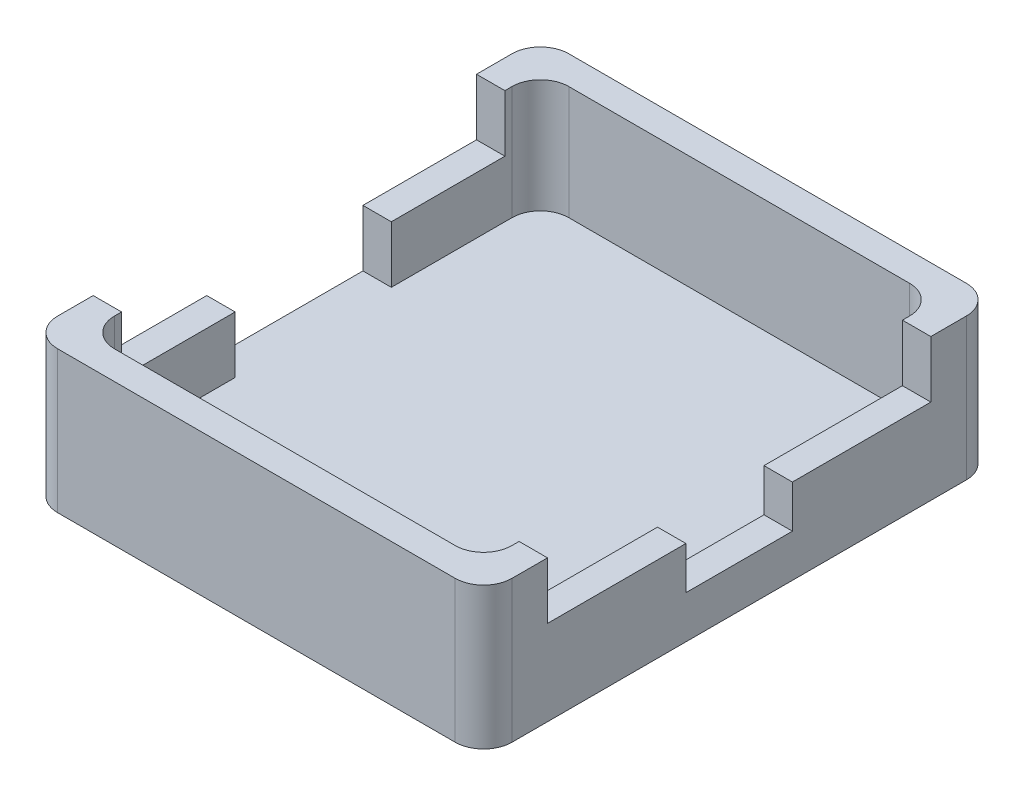
ISO-10303-21;
HEADER;
FILE_DESCRIPTION(('STEP AP214'),'2;1');
FILE_NAME('part.step','',(''),(''),'','','');
FILE_SCHEMA(('AUTOMOTIVE_DESIGN { 1 0 10303 214 1 1 1 1 }'));
ENDSEC;
DATA;
#1=APPLICATION_CONTEXT('core data for automotive mechanical design processes');
#2=APPLICATION_PROTOCOL_DEFINITION('international standard','automotive_design',2000,#1);
#3=PRODUCT_CONTEXT('',#1,'mechanical');
#4=PRODUCT('Part','Part','',(#3));
#5=PRODUCT_RELATED_PRODUCT_CATEGORY('part','',(#4));
#6=PRODUCT_DEFINITION_FORMATION('','',#4);
#7=PRODUCT_DEFINITION_CONTEXT('part definition',#1,'design');
#8=PRODUCT_DEFINITION('design','',#6,#7);
#9=PRODUCT_DEFINITION_SHAPE('','',#8);
#10=(LENGTH_UNIT() NAMED_UNIT(*) SI_UNIT(.MILLI.,.METRE.));
#11=(NAMED_UNIT(*) PLANE_ANGLE_UNIT() SI_UNIT($,.RADIAN.));
#12=(NAMED_UNIT(*) SI_UNIT($,.STERADIAN.) SOLID_ANGLE_UNIT());
#13=UNCERTAINTY_MEASURE_WITH_UNIT(LENGTH_MEASURE(1.E-05),#10,'distance_accuracy_value','');
#14=(GEOMETRIC_REPRESENTATION_CONTEXT(3) GLOBAL_UNCERTAINTY_ASSIGNED_CONTEXT((#13)) GLOBAL_UNIT_ASSIGNED_CONTEXT((#10,
#11,#12)) REPRESENTATION_CONTEXT('',''));
#15=CARTESIAN_POINT('',(0.,0.,0.));
#16=DIRECTION('',(0.,0.,1.));
#17=DIRECTION('',(1.,0.,0.));
#18=AXIS2_PLACEMENT_3D('',#15,#16,#17);
#19=CARTESIAN_POINT('',(0.,10.,0.));
#20=DIRECTION('',(0.,1.,0.));
#21=DIRECTION('',(0.,0.,1.));
#22=AXIS2_PLACEMENT_3D('',#19,#20,#21);
#23=PLANE('',#22);
#24=DIRECTION('',(0.,0.,1.));
#25=VECTOR('',#24,1.);
#26=CARTESIAN_POINT('',(-16.,10.,0.));
#27=LINE('',#26,#25);
#28=CARTESIAN_POINT('',(-16.,10.,13.5));
#29=VERTEX_POINT('',#28);
#30=CARTESIAN_POINT('',(-16.,10.,16.));
#31=VERTEX_POINT('',#30);
#32=EDGE_CURVE('E435',#29,#31,#27,.T.);
#33=ORIENTED_EDGE('',*,*,#32,.T.);
#34=CARTESIAN_POINT('',(-14.,10.,16.));
#35=DIRECTION('',(0.,1.,0.));
#36=DIRECTION('',(0.,0.,1.));
#37=AXIS2_PLACEMENT_3D('',#34,#35,#36);
#38=CIRCLE('',#37,2.);
#39=CARTESIAN_POINT('',(-14.,10.,18.));
#40=VERTEX_POINT('',#39);
#41=EDGE_CURVE('E537',#31,#40,#38,.T.);
#42=ORIENTED_EDGE('',*,*,#41,.T.);
#43=DIRECTION('',(1.,0.,0.));
#44=VECTOR('',#43,1.);
#45=CARTESIAN_POINT('',(0.,10.,18.));
#46=LINE('',#45,#44);
#47=CARTESIAN_POINT('',(14.,10.,18.));
#48=VERTEX_POINT('',#47);
#49=EDGE_CURVE('E424',#40,#48,#46,.T.);
#50=ORIENTED_EDGE('',*,*,#49,.T.);
#51=CARTESIAN_POINT('',(14.,10.,16.));
#52=DIRECTION('',(0.,1.,0.));
#53=DIRECTION('',(0.,0.,1.));
#54=AXIS2_PLACEMENT_3D('',#51,#52,#53);
#55=CIRCLE('',#54,2.);
#56=CARTESIAN_POINT('',(16.,10.,16.));
#57=VERTEX_POINT('',#56);
#58=EDGE_CURVE('E534',#48,#57,#55,.T.);
#59=ORIENTED_EDGE('',*,*,#58,.T.);
#60=DIRECTION('',(0.,0.,-1.));
#61=VECTOR('',#60,1.);
#62=CARTESIAN_POINT('',(16.,10.,0.));
#63=LINE('',#62,#61);
#64=CARTESIAN_POINT('',(16.,9.99999999999999,13.5));
#65=VERTEX_POINT('',#64);
#66=EDGE_CURVE('E429',#57,#65,#63,.T.);
#67=ORIENTED_EDGE('',*,*,#66,.T.);
#68=DIRECTION('',(1.,0.,0.));
#69=VECTOR('',#68,1.);
#70=CARTESIAN_POINT('',(-13.8926513619627,9.99999999999999,13.5));
#71=LINE('',#70,#69);
#72=CARTESIAN_POINT('',(14.,9.99999999999999,13.5));
#73=VERTEX_POINT('',#72);
#74=EDGE_CURVE('E323',#73,#65,#71,.T.);
#75=ORIENTED_EDGE('',*,*,#74,.F.);
#76=DIRECTION('',(0.,0.,-1.));
#77=VECTOR('',#76,1.);
#78=CARTESIAN_POINT('',(14.,10.,0.));
#79=LINE('',#78,#77);
#80=CARTESIAN_POINT('',(14.,10.,14.));
#81=VERTEX_POINT('',#80);
#82=EDGE_CURVE('E286',#81,#73,#79,.T.);
#83=ORIENTED_EDGE('',*,*,#82,.F.);
#84=CARTESIAN_POINT('',(12.,10.,14.));
#85=DIRECTION('',(0.,1.,0.));
#86=DIRECTION('',(0.,0.,1.));
#87=AXIS2_PLACEMENT_3D('',#84,#85,#86);
#88=CIRCLE('',#87,2.);
#89=CARTESIAN_POINT('',(12.,10.,16.));
#90=VERTEX_POINT('',#89);
#91=EDGE_CURVE('E11',#81,#90,#88,.F.);
#92=ORIENTED_EDGE('',*,*,#91,.T.);
#93=DIRECTION('',(1.,0.,0.));
#94=VECTOR('',#93,1.);
#95=CARTESIAN_POINT('',(0.,10.,16.));
#96=LINE('',#95,#94);
#97=CARTESIAN_POINT('',(-12.,10.,16.));
#98=VERTEX_POINT('',#97);
#99=EDGE_CURVE('E411',#98,#90,#96,.T.);
#100=ORIENTED_EDGE('',*,*,#99,.F.);
#101=CARTESIAN_POINT('',(-12.,10.,14.));
#102=DIRECTION('',(0.,1.,0.));
#103=DIRECTION('',(0.,0.,1.));
#104=AXIS2_PLACEMENT_3D('',#101,#102,#103);
#105=CIRCLE('',#104,2.);
#106=CARTESIAN_POINT('',(-14.,10.,14.));
#107=VERTEX_POINT('',#106);
#108=EDGE_CURVE('E558',#98,#107,#105,.F.);
#109=ORIENTED_EDGE('',*,*,#108,.T.);
#110=DIRECTION('',(0.,0.,-1.));
#111=VECTOR('',#110,1.);
#112=CARTESIAN_POINT('',(-14.,10.,0.));
#113=LINE('',#112,#111);
#114=CARTESIAN_POINT('',(-14.,10.,13.5));
#115=VERTEX_POINT('',#114);
#116=EDGE_CURVE('E417',#107,#115,#113,.T.);
#117=ORIENTED_EDGE('',*,*,#116,.T.);
#118=DIRECTION('',(-1.,0.,0.));
#119=VECTOR('',#118,1.);
#120=CARTESIAN_POINT('',(14.1602556806574,10.,13.5));
#121=LINE('',#120,#119);
#122=EDGE_CURVE('E341',#115,#29,#121,.T.);
#123=ORIENTED_EDGE('',*,*,#122,.T.);
#124=EDGE_LOOP('',(#33,#42,#50,#59,#67,#75,#83,#92,#100,#109,#117,#123));
#125=FACE_BOUND('',#124,.T.);
#126=ADVANCED_FACE('F47',(#125),#23,.T.);
#127=CARTESIAN_POINT('',(-14.,10.,0.));
#128=DIRECTION('',(-1.,0.,0.));
#129=DIRECTION('',(0.,0.,1.));
#130=AXIS2_PLACEMENT_3D('',#127,#128,#129);
#131=PLANE('',#130);
#132=ORIENTED_EDGE('',*,*,#116,.F.);
#133=DIRECTION('',(0.,-1.,0.));
#134=VECTOR('',#133,1.);
#135=CARTESIAN_POINT('',(-14.,10.,14.));
#136=LINE('',#135,#134);
#137=CARTESIAN_POINT('',(-14.,2.,14.));
#138=VERTEX_POINT('',#137);
#139=EDGE_CURVE('E468',#107,#138,#136,.T.);
#140=ORIENTED_EDGE('',*,*,#139,.T.);
#141=DIRECTION('',(0.,0.,-1.));
#142=VECTOR('',#141,1.);
#143=CARTESIAN_POINT('',(-14.,2.,0.));
#144=LINE('',#143,#142);
#145=CARTESIAN_POINT('',(-14.,2.,5.49999999999999));
#146=VERTEX_POINT('',#145);
#147=EDGE_CURVE('E448',#138,#146,#144,.T.);
#148=ORIENTED_EDGE('',*,*,#147,.T.);
#149=DIRECTION('',(0.,-1.,0.));
#150=VECTOR('',#149,1.);
#151=CARTESIAN_POINT('',(-14.,6.,5.49999999999999));
#152=LINE('',#151,#150);
#153=CARTESIAN_POINT('',(-14.,6.,5.49999999999999));
#154=VERTEX_POINT('',#153);
#155=EDGE_CURVE('E344',#154,#146,#152,.T.);
#156=ORIENTED_EDGE('',*,*,#155,.F.);
#157=DIRECTION('',(0.,0.,-1.));
#158=VECTOR('',#157,1.);
#159=CARTESIAN_POINT('',(-14.,6.,13.5));
#160=LINE('',#159,#158);
#161=CARTESIAN_POINT('',(-14.,6.,13.5));
#162=VERTEX_POINT('',#161);
#163=EDGE_CURVE('E348',#162,#154,#160,.T.);
#164=ORIENTED_EDGE('',*,*,#163,.F.);
#165=DIRECTION('',(0.,-1.,0.));
#166=VECTOR('',#165,1.);
#167=CARTESIAN_POINT('',(-14.,10.,13.5));
#168=LINE('',#167,#166);
#169=EDGE_CURVE('E351',#115,#162,#168,.T.);
#170=ORIENTED_EDGE('',*,*,#169,.F.);
#171=EDGE_LOOP('',(#132,#140,#148,#156,#164,#170));
#172=FACE_BOUND('',#171,.T.);
#173=ADVANCED_FACE('F640',(#172),#131,.F.);
#174=CARTESIAN_POINT('',(16.,2.,18.));
#175=DIRECTION('',(-1.,0.,0.));
#176=DIRECTION('',(0.,0.,1.));
#177=AXIS2_PLACEMENT_3D('',#174,#175,#176);
#178=PLANE('',#177);
#179=DIRECTION('',(0.,0.,-1.));
#180=VECTOR('',#179,1.);
#181=CARTESIAN_POINT('',(16.,0.,18.));
#182=LINE('',#181,#180);
#183=CARTESIAN_POINT('',(16.,0.,16.));
#184=VERTEX_POINT('',#183);
#185=CARTESIAN_POINT('',(16.,0.,-16.));
#186=VERTEX_POINT('',#185);
#187=EDGE_CURVE('E439',#184,#186,#182,.T.);
#188=ORIENTED_EDGE('',*,*,#187,.T.);
#189=DIRECTION('',(0.,-1.,0.));
#190=VECTOR('',#189,1.);
#191=CARTESIAN_POINT('',(16.,2.,-16.));
#192=LINE('',#191,#190);
#193=CARTESIAN_POINT('',(16.,10.,-16.));
#194=VERTEX_POINT('',#193);
#195=EDGE_CURVE('E63',#186,#194,#192,.F.);
#196=ORIENTED_EDGE('',*,*,#195,.T.);
#197=CARTESIAN_POINT('',(16.,10.,-13.5));
#198=VERTEX_POINT('',#197);
#199=EDGE_CURVE('E428',#198,#194,#63,.T.);
#200=ORIENTED_EDGE('',*,*,#199,.F.);
#201=DIRECTION('',(0.,1.,0.));
#202=VECTOR('',#201,1.);
#203=CARTESIAN_POINT('',(16.,9.99999999999999,-13.5));
#204=LINE('',#203,#202);
#205=CARTESIAN_POINT('',(16.,6.,-13.5));
#206=VERTEX_POINT('',#205);
#207=EDGE_CURVE('E288',#206,#198,#204,.T.);
#208=ORIENTED_EDGE('',*,*,#207,.F.);
#209=DIRECTION('',(0.,0.,-1.));
#210=VECTOR('',#209,1.);
#211=CARTESIAN_POINT('',(16.,6.,-13.5));
#212=LINE('',#211,#210);
#213=CARTESIAN_POINT('',(16.,6.,-3.75));
#214=VERTEX_POINT('',#213);
#215=EDGE_CURVE('E291',#214,#206,#212,.T.);
#216=ORIENTED_EDGE('',*,*,#215,.F.);
#217=DIRECTION('',(0.,1.,0.));
#218=VECTOR('',#217,1.);
#219=CARTESIAN_POINT('',(16.,6.,-3.75));
#220=LINE('',#219,#218);
#221=CARTESIAN_POINT('',(16.,3.,-3.75));
#222=VERTEX_POINT('',#221);
#223=EDGE_CURVE('E692',#222,#214,#220,.T.);
#224=ORIENTED_EDGE('',*,*,#223,.F.);
#225=DIRECTION('',(0.,0.,-1.));
#226=VECTOR('',#225,1.);
#227=CARTESIAN_POINT('',(16.,3.,3.75));
#228=LINE('',#227,#226);
#229=CARTESIAN_POINT('',(16.,3.,3.75));
#230=VERTEX_POINT('',#229);
#231=EDGE_CURVE('E695',#230,#222,#228,.T.);
#232=ORIENTED_EDGE('',*,*,#231,.F.);
#233=DIRECTION('',(0.,-1.,0.));
#234=VECTOR('',#233,1.);
#235=CARTESIAN_POINT('',(16.,6.,3.75));
#236=LINE('',#235,#234);
#237=CARTESIAN_POINT('',(16.,6.,3.75));
#238=VERTEX_POINT('',#237);
#239=EDGE_CURVE('E701',#238,#230,#236,.T.);
#240=ORIENTED_EDGE('',*,*,#239,.F.);
#241=DIRECTION('',(0.,0.,-1.));
#242=VECTOR('',#241,1.);
#243=CARTESIAN_POINT('',(16.,6.,13.5));
#244=LINE('',#243,#242);
#245=CARTESIAN_POINT('',(16.,6.,13.5));
#246=VERTEX_POINT('',#245);
#247=EDGE_CURVE('E704',#246,#238,#244,.T.);
#248=ORIENTED_EDGE('',*,*,#247,.F.);
#249=DIRECTION('',(0.,-1.,0.));
#250=VECTOR('',#249,1.);
#251=CARTESIAN_POINT('',(16.,9.99999999999999,13.5));
#252=LINE('',#251,#250);
#253=EDGE_CURVE('E279',#65,#246,#252,.T.);
#254=ORIENTED_EDGE('',*,*,#253,.F.);
#255=ORIENTED_EDGE('',*,*,#66,.F.);
#256=DIRECTION('',(0.,-1.,0.));
#257=VECTOR('',#256,1.);
#258=CARTESIAN_POINT('',(16.,2.,16.));
#259=LINE('',#258,#257);
#260=EDGE_CURVE('E552',#57,#184,#259,.T.);
#261=ORIENTED_EDGE('',*,*,#260,.T.);
#262=EDGE_LOOP('',(#188,#196,#200,#208,#216,#224,#232,#240,#248,#254,#255,#261));
#263=FACE_BOUND('',#262,.T.);
#264=ADVANCED_FACE('F622',(#263),#178,.F.);
#265=CARTESIAN_POINT('',(-16.,2.,-18.));
#266=DIRECTION('',(0.,0.,1.));
#267=DIRECTION('',(1.,0.,0.));
#268=AXIS2_PLACEMENT_3D('',#265,#266,#267);
#269=PLANE('',#268);
#270=DIRECTION('',(-1.,0.,0.));
#271=VECTOR('',#270,1.);
#272=CARTESIAN_POINT('',(-16.,0.,-18.));
#273=LINE('',#272,#271);
#274=CARTESIAN_POINT('',(14.,0.,-18.));
#275=VERTEX_POINT('',#274);
#276=CARTESIAN_POINT('',(-14.,0.,-18.));
#277=VERTEX_POINT('',#276);
#278=EDGE_CURVE('E457',#275,#277,#273,.T.);
#279=ORIENTED_EDGE('',*,*,#278,.T.);
#280=DIRECTION('',(0.,-1.,0.));
#281=VECTOR('',#280,1.);
#282=CARTESIAN_POINT('',(-14.,2.,-18.));
#283=LINE('',#282,#281);
#284=CARTESIAN_POINT('',(-14.,10.,-18.));
#285=VERTEX_POINT('',#284);
#286=EDGE_CURVE('E71',#277,#285,#283,.F.);
#287=ORIENTED_EDGE('',*,*,#286,.T.);
#288=DIRECTION('',(-1.,0.,0.));
#289=VECTOR('',#288,1.);
#290=CARTESIAN_POINT('',(0.,10.,-18.));
#291=LINE('',#290,#289);
#292=CARTESIAN_POINT('',(14.,10.,-18.));
#293=VERTEX_POINT('',#292);
#294=EDGE_CURVE('E432',#293,#285,#291,.T.);
#295=ORIENTED_EDGE('',*,*,#294,.F.);
#296=DIRECTION('',(0.,-1.,0.));
#297=VECTOR('',#296,1.);
#298=CARTESIAN_POINT('',(14.,2.,-18.));
#299=LINE('',#298,#297);
#300=EDGE_CURVE('E540',#293,#275,#299,.T.);
#301=ORIENTED_EDGE('',*,*,#300,.T.);
#302=EDGE_LOOP('',(#279,#287,#295,#301));
#303=FACE_BOUND('',#302,.T.);
#304=ADVANCED_FACE('F675',(#303),#269,.F.);
#305=CARTESIAN_POINT('',(-16.,2.,18.));
#306=DIRECTION('',(1.,0.,0.));
#307=DIRECTION('',(0.,0.,-1.));
#308=AXIS2_PLACEMENT_3D('',#305,#306,#307);
#309=PLANE('',#308);
#310=DIRECTION('',(0.,0.,1.));
#311=VECTOR('',#310,1.);
#312=CARTESIAN_POINT('',(-16.,0.,18.));
#313=LINE('',#312,#311);
#314=CARTESIAN_POINT('',(-16.,0.,-16.));
#315=VERTEX_POINT('',#314);
#316=CARTESIAN_POINT('',(-16.,0.,16.));
#317=VERTEX_POINT('',#316);
#318=EDGE_CURVE('E460',#315,#317,#313,.T.);
#319=ORIENTED_EDGE('',*,*,#318,.T.);
#320=DIRECTION('',(0.,-1.,0.));
#321=VECTOR('',#320,1.);
#322=CARTESIAN_POINT('',(-16.,2.,16.));
#323=LINE('',#322,#321);
#324=EDGE_CURVE('E531',#317,#31,#323,.F.);
#325=ORIENTED_EDGE('',*,*,#324,.T.);
#326=ORIENTED_EDGE('',*,*,#32,.F.);
#327=DIRECTION('',(0.,1.,0.));
#328=VECTOR('',#327,1.);
#329=CARTESIAN_POINT('',(-16.,10.,13.5));
#330=LINE('',#329,#328);
#331=CARTESIAN_POINT('',(-16.,6.,13.5));
#332=VERTEX_POINT('',#331);
#333=EDGE_CURVE('E378',#332,#29,#330,.T.);
#334=ORIENTED_EDGE('',*,*,#333,.F.);
#335=DIRECTION('',(0.,0.,1.));
#336=VECTOR('',#335,1.);
#337=CARTESIAN_POINT('',(-16.,6.,13.5));
#338=LINE('',#337,#336);
#339=CARTESIAN_POINT('',(-16.,6.,5.49999999999999));
#340=VERTEX_POINT('',#339);
#341=EDGE_CURVE('E374',#340,#332,#338,.T.);
#342=ORIENTED_EDGE('',*,*,#341,.F.);
#343=DIRECTION('',(0.,1.,0.));
#344=VECTOR('',#343,1.);
#345=CARTESIAN_POINT('',(-16.,6.,5.49999999999999));
#346=LINE('',#345,#344);
#347=CARTESIAN_POINT('',(-16.,2.,5.49999999999999));
#348=VERTEX_POINT('',#347);
#349=EDGE_CURVE('E370',#348,#340,#346,.T.);
#350=ORIENTED_EDGE('',*,*,#349,.F.);
#351=DIRECTION('',(0.,0.,1.));
#352=VECTOR('',#351,1.);
#353=CARTESIAN_POINT('',(-16.,2.,-5.50000000000001));
#354=LINE('',#353,#352);
#355=CARTESIAN_POINT('',(-16.,2.,-5.50000000000001));
#356=VERTEX_POINT('',#355);
#357=EDGE_CURVE('E366',#356,#348,#354,.T.);
#358=ORIENTED_EDGE('',*,*,#357,.F.);
#359=DIRECTION('',(0.,-1.,0.));
#360=VECTOR('',#359,1.);
#361=CARTESIAN_POINT('',(-16.,6.,-5.50000000000001));
#362=LINE('',#361,#360);
#363=CARTESIAN_POINT('',(-16.,6.,-5.50000000000001));
#364=VERTEX_POINT('',#363);
#365=EDGE_CURVE('E362',#364,#356,#362,.T.);
#366=ORIENTED_EDGE('',*,*,#365,.F.);
#367=DIRECTION('',(0.,0.,1.));
#368=VECTOR('',#367,1.);
#369=CARTESIAN_POINT('',(-16.,6.,-13.5));
#370=LINE('',#369,#368);
#371=CARTESIAN_POINT('',(-16.,6.,-13.5));
#372=VERTEX_POINT('',#371);
#373=EDGE_CURVE('E358',#372,#364,#370,.T.);
#374=ORIENTED_EDGE('',*,*,#373,.F.);
#375=DIRECTION('',(0.,-1.,0.));
#376=VECTOR('',#375,1.);
#377=CARTESIAN_POINT('',(-16.,10.,-13.5));
#378=LINE('',#377,#376);
#379=CARTESIAN_POINT('',(-16.,10.,-13.5));
#380=VERTEX_POINT('',#379);
#381=EDGE_CURVE('E336',#380,#372,#378,.T.);
#382=ORIENTED_EDGE('',*,*,#381,.F.);
#383=CARTESIAN_POINT('',(-16.,10.,-16.));
#384=VERTEX_POINT('',#383);
#385=EDGE_CURVE('E436',#384,#380,#27,.T.);
#386=ORIENTED_EDGE('',*,*,#385,.F.);
#387=DIRECTION('',(0.,-1.,0.));
#388=VECTOR('',#387,1.);
#389=CARTESIAN_POINT('',(-16.,2.,-16.));
#390=LINE('',#389,#388);
#391=EDGE_CURVE('E527',#384,#315,#390,.T.);
#392=ORIENTED_EDGE('',*,*,#391,.T.);
#393=EDGE_LOOP('',(#319,#325,#326,#334,#342,#350,#358,#366,#374,#382,#386,#392));
#394=FACE_BOUND('',#393,.T.);
#395=ADVANCED_FACE('F648',(#394),#309,.F.);
#396=CARTESIAN_POINT('',(-16.,2.,18.));
#397=DIRECTION('',(0.,0.,-1.));
#398=DIRECTION('',(-1.,0.,0.));
#399=AXIS2_PLACEMENT_3D('',#396,#397,#398);
#400=PLANE('',#399);
#401=ORIENTED_EDGE('',*,*,#49,.F.);
#402=DIRECTION('',(0.,-1.,0.));
#403=VECTOR('',#402,1.);
#404=CARTESIAN_POINT('',(-14.,2.,18.));
#405=LINE('',#404,#403);
#406=CARTESIAN_POINT('',(-14.,0.,18.));
#407=VERTEX_POINT('',#406);
#408=EDGE_CURVE('E511',#40,#407,#405,.T.);
#409=ORIENTED_EDGE('',*,*,#408,.T.);
#410=DIRECTION('',(1.,0.,0.));
#411=VECTOR('',#410,1.);
#412=CARTESIAN_POINT('',(-16.,0.,18.));
#413=LINE('',#412,#411);
#414=CARTESIAN_POINT('',(14.,0.,18.));
#415=VERTEX_POINT('',#414);
#416=EDGE_CURVE('E464',#407,#415,#413,.T.);
#417=ORIENTED_EDGE('',*,*,#416,.T.);
#418=DIRECTION('',(0.,-1.,0.));
#419=VECTOR('',#418,1.);
#420=CARTESIAN_POINT('',(14.,2.,18.));
#421=LINE('',#420,#419);
#422=EDGE_CURVE('E508',#415,#48,#421,.F.);
#423=ORIENTED_EDGE('',*,*,#422,.T.);
#424=EDGE_LOOP('',(#401,#409,#417,#423));
#425=FACE_BOUND('',#424,.T.);
#426=ADVANCED_FACE('F612',(#425),#400,.F.);
#427=CARTESIAN_POINT('',(0.,0.,0.));
#428=DIRECTION('',(0.,-1.,0.));
#429=DIRECTION('',(0.,0.,-1.));
#430=AXIS2_PLACEMENT_3D('',#427,#428,#429);
#431=PLANE('',#430);
#432=ORIENTED_EDGE('',*,*,#416,.F.);
#433=CARTESIAN_POINT('',(-14.,0.,16.));
#434=DIRECTION('',(0.,-1.,0.));
#435=DIRECTION('',(0.,0.,-1.));
#436=AXIS2_PLACEMENT_3D('',#433,#434,#435);
#437=CIRCLE('',#436,2.);
#438=EDGE_CURVE('E524',#407,#317,#437,.T.);
#439=ORIENTED_EDGE('',*,*,#438,.T.);
#440=ORIENTED_EDGE('',*,*,#318,.F.);
#441=CARTESIAN_POINT('',(-14.,0.,-16.));
#442=DIRECTION('',(0.,-1.,0.));
#443=DIRECTION('',(0.,0.,-1.));
#444=AXIS2_PLACEMENT_3D('',#441,#442,#443);
#445=CIRCLE('',#444,2.);
#446=EDGE_CURVE('E521',#315,#277,#445,.T.);
#447=ORIENTED_EDGE('',*,*,#446,.T.);
#448=ORIENTED_EDGE('',*,*,#278,.F.);
#449=CARTESIAN_POINT('',(14.,0.,-16.));
#450=DIRECTION('',(0.,-1.,0.));
#451=DIRECTION('',(0.,0.,-1.));
#452=AXIS2_PLACEMENT_3D('',#449,#450,#451);
#453=CIRCLE('',#452,2.);
#454=EDGE_CURVE('E518',#275,#186,#453,.T.);
#455=ORIENTED_EDGE('',*,*,#454,.T.);
#456=ORIENTED_EDGE('',*,*,#187,.F.);
#457=CARTESIAN_POINT('',(14.,0.,16.));
#458=DIRECTION('',(0.,-1.,0.));
#459=DIRECTION('',(0.,0.,-1.));
#460=AXIS2_PLACEMENT_3D('',#457,#458,#459);
#461=CIRCLE('',#460,2.);
#462=EDGE_CURVE('E515',#184,#415,#461,.T.);
#463=ORIENTED_EDGE('',*,*,#462,.T.);
#464=EDGE_LOOP('',(#432,#439,#440,#447,#448,#455,#456,#463));
#465=FACE_BOUND('',#464,.T.);
#466=ADVANCED_FACE('F615',(#465),#431,.T.);
#467=CARTESIAN_POINT('',(14.,10.,0.));
#468=DIRECTION('',(-1.,0.,0.));
#469=DIRECTION('',(0.,0.,1.));
#470=AXIS2_PLACEMENT_3D('',#467,#468,#469);
#471=PLANE('',#470);
#472=CARTESIAN_POINT('',(14.,9.99999999999999,-13.5));
#473=VERTEX_POINT('',#472);
#474=CARTESIAN_POINT('',(14.,10.,-14.));
#475=VERTEX_POINT('',#474);
#476=EDGE_CURVE('E412',#473,#475,#79,.T.);
#477=ORIENTED_EDGE('',*,*,#476,.T.);
#478=DIRECTION('',(0.,-1.,0.));
#479=VECTOR('',#478,1.);
#480=CARTESIAN_POINT('',(14.,10.,-14.));
#481=LINE('',#480,#479);
#482=CARTESIAN_POINT('',(14.,2.,-14.));
#483=VERTEX_POINT('',#482);
#484=EDGE_CURVE('E504',#475,#483,#481,.T.);
#485=ORIENTED_EDGE('',*,*,#484,.T.);
#486=DIRECTION('',(0.,0.,-1.));
#487=VECTOR('',#486,1.);
#488=CARTESIAN_POINT('',(14.,2.,0.));
#489=LINE('',#488,#487);
#490=CARTESIAN_POINT('',(14.,2.,14.));
#491=VERTEX_POINT('',#490);
#492=EDGE_CURVE('E408',#491,#483,#489,.T.);
#493=ORIENTED_EDGE('',*,*,#492,.F.);
#494=DIRECTION('',(0.,-1.,0.));
#495=VECTOR('',#494,1.);
#496=CARTESIAN_POINT('',(14.,10.,14.));
#497=LINE('',#496,#495);
#498=EDGE_CURVE('E501',#491,#81,#497,.F.);
#499=ORIENTED_EDGE('',*,*,#498,.T.);
#500=ORIENTED_EDGE('',*,*,#82,.T.);
#501=DIRECTION('',(0.,-1.,0.));
#502=VECTOR('',#501,1.);
#503=CARTESIAN_POINT('',(14.,9.99999999999999,13.5));
#504=LINE('',#503,#502);
#505=CARTESIAN_POINT('',(14.,6.,13.5));
#506=VERTEX_POINT('',#505);
#507=EDGE_CURVE('E276',#73,#506,#504,.T.);
#508=ORIENTED_EDGE('',*,*,#507,.T.);
#509=DIRECTION('',(0.,0.,-1.));
#510=VECTOR('',#509,1.);
#511=CARTESIAN_POINT('',(14.,6.,13.5));
#512=LINE('',#511,#510);
#513=CARTESIAN_POINT('',(14.,6.,3.75));
#514=VERTEX_POINT('',#513);
#515=EDGE_CURVE('E260',#506,#514,#512,.T.);
#516=ORIENTED_EDGE('',*,*,#515,.T.);
#517=DIRECTION('',(0.,-1.,0.));
#518=VECTOR('',#517,1.);
#519=CARTESIAN_POINT('',(14.,6.,3.75));
#520=LINE('',#519,#518);
#521=CARTESIAN_POINT('',(14.,3.,3.75));
#522=VERTEX_POINT('',#521);
#523=EDGE_CURVE('E317',#514,#522,#520,.T.);
#524=ORIENTED_EDGE('',*,*,#523,.T.);
#525=DIRECTION('',(0.,0.,-1.));
#526=VECTOR('',#525,1.);
#527=CARTESIAN_POINT('',(14.,3.,3.75));
#528=LINE('',#527,#526);
#529=CARTESIAN_POINT('',(14.,3.,-3.75));
#530=VERTEX_POINT('',#529);
#531=EDGE_CURVE('E312',#522,#530,#528,.T.);
#532=ORIENTED_EDGE('',*,*,#531,.T.);
#533=DIRECTION('',(0.,1.,0.));
#534=VECTOR('',#533,1.);
#535=CARTESIAN_POINT('',(14.,6.,-3.75));
#536=LINE('',#535,#534);
#537=CARTESIAN_POINT('',(14.,6.,-3.75));
#538=VERTEX_POINT('',#537);
#539=EDGE_CURVE('E307',#530,#538,#536,.T.);
#540=ORIENTED_EDGE('',*,*,#539,.T.);
#541=DIRECTION('',(0.,0.,-1.));
#542=VECTOR('',#541,1.);
#543=CARTESIAN_POINT('',(14.,6.,-13.5));
#544=LINE('',#543,#542);
#545=CARTESIAN_POINT('',(14.,6.,-13.5));
#546=VERTEX_POINT('',#545);
#547=EDGE_CURVE('E302',#538,#546,#544,.T.);
#548=ORIENTED_EDGE('',*,*,#547,.T.);
#549=DIRECTION('',(0.,1.,0.));
#550=VECTOR('',#549,1.);
#551=CARTESIAN_POINT('',(14.,9.99999999999999,-13.5));
#552=LINE('',#551,#550);
#553=EDGE_CURVE('E296',#546,#473,#552,.T.);
#554=ORIENTED_EDGE('',*,*,#553,.T.);
#555=EDGE_LOOP('',(#477,#485,#493,#499,#500,#508,#516,#524,#532,#540,#548,#554));
#556=FACE_BOUND('',#555,.T.);
#557=ADVANCED_FACE('F284',(#556),#471,.T.);
#558=CARTESIAN_POINT('',(0.,10.,16.));
#559=DIRECTION('',(0.,0.,-1.));
#560=DIRECTION('',(-1.,0.,0.));
#561=AXIS2_PLACEMENT_3D('',#558,#559,#560);
#562=PLANE('',#561);
#563=DIRECTION('',(1.,0.,0.));
#564=VECTOR('',#563,1.);
#565=CARTESIAN_POINT('',(0.,2.,16.));
#566=LINE('',#565,#564);
#567=CARTESIAN_POINT('',(-12.,2.,16.));
#568=VERTEX_POINT('',#567);
#569=CARTESIAN_POINT('',(12.,2.,16.));
#570=VERTEX_POINT('',#569);
#571=EDGE_CURVE('E443',#568,#570,#566,.T.);
#572=ORIENTED_EDGE('',*,*,#571,.F.);
#573=DIRECTION('',(0.,-1.,0.));
#574=VECTOR('',#573,1.);
#575=CARTESIAN_POINT('',(-12.,10.,16.));
#576=LINE('',#575,#574);
#577=EDGE_CURVE('E488',#568,#98,#576,.F.);
#578=ORIENTED_EDGE('',*,*,#577,.T.);
#579=ORIENTED_EDGE('',*,*,#99,.T.);
#580=DIRECTION('',(0.,-1.,0.));
#581=VECTOR('',#580,1.);
#582=CARTESIAN_POINT('',(12.,2.,16.));
#583=LINE('',#582,#581);
#584=EDGE_CURVE('E484',#90,#570,#583,.T.);
#585=ORIENTED_EDGE('',*,*,#584,.T.);
#586=EDGE_LOOP('',(#572,#578,#579,#585));
#587=FACE_BOUND('',#586,.T.);
#588=ADVANCED_FACE('F631',(#587),#562,.T.);
#589=CARTESIAN_POINT('',(-14.,2.,-5.50000000000001));
#590=VERTEX_POINT('',#589);
#591=CARTESIAN_POINT('',(-14.,2.,-14.));
#592=VERTEX_POINT('',#591);
#593=EDGE_CURVE('E447',#590,#592,#144,.T.);
#594=ORIENTED_EDGE('',*,*,#593,.T.);
#595=DIRECTION('',(0.,-1.,0.));
#596=VECTOR('',#595,1.);
#597=CARTESIAN_POINT('',(-14.,10.,-14.));
#598=LINE('',#597,#596);
#599=CARTESIAN_POINT('',(-14.,10.,-14.));
#600=VERTEX_POINT('',#599);
#601=EDGE_CURVE('E498',#592,#600,#598,.F.);
#602=ORIENTED_EDGE('',*,*,#601,.T.);
#603=CARTESIAN_POINT('',(-14.,10.,-13.5));
#604=VERTEX_POINT('',#603);
#605=EDGE_CURVE('E416',#604,#600,#113,.T.);
#606=ORIENTED_EDGE('',*,*,#605,.F.);
#607=DIRECTION('',(0.,1.,0.));
#608=VECTOR('',#607,1.);
#609=CARTESIAN_POINT('',(-14.,10.,-13.5));
#610=LINE('',#609,#608);
#611=CARTESIAN_POINT('',(-14.,6.,-13.5));
#612=VERTEX_POINT('',#611);
#613=EDGE_CURVE('E354',#612,#604,#610,.T.);
#614=ORIENTED_EDGE('',*,*,#613,.F.);
#615=DIRECTION('',(0.,0.,-1.));
#616=VECTOR('',#615,1.);
#617=CARTESIAN_POINT('',(-14.,6.,-13.5));
#618=LINE('',#617,#616);
#619=CARTESIAN_POINT('',(-14.,6.,-5.49999999999999));
#620=VERTEX_POINT('',#619);
#621=EDGE_CURVE('E337',#620,#612,#618,.T.);
#622=ORIENTED_EDGE('',*,*,#621,.F.);
#623=DIRECTION('',(0.,1.,0.));
#624=VECTOR('',#623,1.);
#625=CARTESIAN_POINT('',(-14.,6.,-5.50000000000001));
#626=LINE('',#625,#624);
#627=EDGE_CURVE('E340',#590,#620,#626,.T.);
#628=ORIENTED_EDGE('',*,*,#627,.F.);
#629=EDGE_LOOP('',(#594,#602,#606,#614,#622,#628));
#630=FACE_BOUND('',#629,.T.);
#631=ADVANCED_FACE('F590',(#630),#131,.F.);
#632=CARTESIAN_POINT('',(0.,10.,-16.));
#633=DIRECTION('',(0.,0.,-1.));
#634=DIRECTION('',(-1.,0.,0.));
#635=AXIS2_PLACEMENT_3D('',#632,#633,#634);
#636=PLANE('',#635);
#637=DIRECTION('',(1.,0.,0.));
#638=VECTOR('',#637,1.);
#639=CARTESIAN_POINT('',(0.,10.,-16.));
#640=LINE('',#639,#638);
#641=CARTESIAN_POINT('',(-12.,10.,-16.));
#642=VERTEX_POINT('',#641);
#643=CARTESIAN_POINT('',(12.,10.,-16.));
#644=VERTEX_POINT('',#643);
#645=EDGE_CURVE('E420',#642,#644,#640,.T.);
#646=ORIENTED_EDGE('',*,*,#645,.F.);
#647=DIRECTION('',(0.,-1.,0.));
#648=VECTOR('',#647,1.);
#649=CARTESIAN_POINT('',(-12.,2.,-16.));
#650=LINE('',#649,#648);
#651=CARTESIAN_POINT('',(-12.,2.,-16.));
#652=VERTEX_POINT('',#651);
#653=EDGE_CURVE('E494',#642,#652,#650,.T.);
#654=ORIENTED_EDGE('',*,*,#653,.T.);
#655=DIRECTION('',(1.,0.,0.));
#656=VECTOR('',#655,1.);
#657=CARTESIAN_POINT('',(0.,2.,-16.));
#658=LINE('',#657,#656);
#659=CARTESIAN_POINT('',(12.,2.,-16.));
#660=VERTEX_POINT('',#659);
#661=EDGE_CURVE('E451',#652,#660,#658,.T.);
#662=ORIENTED_EDGE('',*,*,#661,.T.);
#663=DIRECTION('',(0.,-1.,0.));
#664=VECTOR('',#663,1.);
#665=CARTESIAN_POINT('',(12.,10.,-16.));
#666=LINE('',#665,#664);
#667=EDGE_CURVE('E491',#660,#644,#666,.F.);
#668=ORIENTED_EDGE('',*,*,#667,.T.);
#669=EDGE_LOOP('',(#646,#654,#662,#668));
#670=FACE_BOUND('',#669,.T.);
#671=ADVANCED_FACE('F580',(#670),#636,.F.);
#672=ORIENTED_EDGE('',*,*,#294,.T.);
#673=CARTESIAN_POINT('',(-14.,10.,-16.));
#674=DIRECTION('',(0.,1.,0.));
#675=DIRECTION('',(0.,0.,1.));
#676=AXIS2_PLACEMENT_3D('',#673,#674,#675);
#677=CIRCLE('',#676,2.);
#678=EDGE_CURVE('E549',#285,#384,#677,.T.);
#679=ORIENTED_EDGE('',*,*,#678,.T.);
#680=ORIENTED_EDGE('',*,*,#385,.T.);
#681=DIRECTION('',(-1.,0.,0.));
#682=VECTOR('',#681,1.);
#683=CARTESIAN_POINT('',(14.1602556806575,10.,-13.5));
#684=LINE('',#683,#682);
#685=EDGE_CURVE('E381',#604,#380,#684,.T.);
#686=ORIENTED_EDGE('',*,*,#685,.F.);
#687=ORIENTED_EDGE('',*,*,#605,.T.);
#688=CARTESIAN_POINT('',(-12.,10.,-14.));
#689=DIRECTION('',(0.,1.,0.));
#690=DIRECTION('',(0.,0.,1.));
#691=AXIS2_PLACEMENT_3D('',#688,#689,#690);
#692=CIRCLE('',#691,2.);
#693=EDGE_CURVE('E561',#600,#642,#692,.F.);
#694=ORIENTED_EDGE('',*,*,#693,.T.);
#695=ORIENTED_EDGE('',*,*,#645,.T.);
#696=CARTESIAN_POINT('',(12.,10.,-14.));
#697=DIRECTION('',(0.,1.,0.));
#698=DIRECTION('',(0.,0.,1.));
#699=AXIS2_PLACEMENT_3D('',#696,#697,#698);
#700=CIRCLE('',#699,2.);
#701=EDGE_CURVE('E56',#644,#475,#700,.F.);
#702=ORIENTED_EDGE('',*,*,#701,.T.);
#703=ORIENTED_EDGE('',*,*,#476,.F.);
#704=DIRECTION('',(1.,0.,0.));
#705=VECTOR('',#704,1.);
#706=CARTESIAN_POINT('',(-13.8926513619627,9.99999999999999,-13.5));
#707=LINE('',#706,#705);
#708=EDGE_CURVE('E300',#473,#198,#707,.T.);
#709=ORIENTED_EDGE('',*,*,#708,.T.);
#710=ORIENTED_EDGE('',*,*,#199,.T.);
#711=CARTESIAN_POINT('',(14.,10.,-16.));
#712=DIRECTION('',(0.,1.,0.));
#713=DIRECTION('',(0.,0.,1.));
#714=AXIS2_PLACEMENT_3D('',#711,#712,#713);
#715=CIRCLE('',#714,2.);
#716=EDGE_CURVE('E546',#194,#293,#715,.T.);
#717=ORIENTED_EDGE('',*,*,#716,.T.);
#718=EDGE_LOOP('',(#672,#679,#680,#686,#687,#694,#695,#702,#703,#709,#710,#717));
#719=FACE_BOUND('',#718,.T.);
#720=ADVANCED_FACE('F567',(#719),#23,.T.);
#721=CARTESIAN_POINT('',(0.,2.,0.));
#722=DIRECTION('',(0.,-1.,0.));
#723=DIRECTION('',(0.,0.,-1.));
#724=AXIS2_PLACEMENT_3D('',#721,#722,#723);
#725=PLANE('',#724);
#726=ORIENTED_EDGE('',*,*,#147,.F.);
#727=CARTESIAN_POINT('',(-12.,2.,14.));
#728=DIRECTION('',(0.,-1.,0.));
#729=DIRECTION('',(0.,0.,-1.));
#730=AXIS2_PLACEMENT_3D('',#727,#728,#729);
#731=CIRCLE('',#730,2.);
#732=EDGE_CURVE('E481',#138,#568,#731,.F.);
#733=ORIENTED_EDGE('',*,*,#732,.T.);
#734=ORIENTED_EDGE('',*,*,#571,.T.);
#735=CARTESIAN_POINT('',(12.,2.,14.));
#736=DIRECTION('',(0.,-1.,0.));
#737=DIRECTION('',(0.,0.,-1.));
#738=AXIS2_PLACEMENT_3D('',#735,#736,#737);
#739=CIRCLE('',#738,2.);
#740=EDGE_CURVE('E472',#570,#491,#739,.F.);
#741=ORIENTED_EDGE('',*,*,#740,.T.);
#742=ORIENTED_EDGE('',*,*,#492,.T.);
#743=CARTESIAN_POINT('',(12.,2.,-14.));
#744=DIRECTION('',(0.,-1.,0.));
#745=DIRECTION('',(0.,0.,-1.));
#746=AXIS2_PLACEMENT_3D('',#743,#744,#745);
#747=CIRCLE('',#746,2.);
#748=EDGE_CURVE('E475',#483,#660,#747,.F.);
#749=ORIENTED_EDGE('',*,*,#748,.T.);
#750=ORIENTED_EDGE('',*,*,#661,.F.);
#751=CARTESIAN_POINT('',(-12.,2.,-14.));
#752=DIRECTION('',(0.,-1.,0.));
#753=DIRECTION('',(0.,0.,-1.));
#754=AXIS2_PLACEMENT_3D('',#751,#752,#753);
#755=CIRCLE('',#754,2.);
#756=EDGE_CURVE('E478',#652,#592,#755,.F.);
#757=ORIENTED_EDGE('',*,*,#756,.T.);
#758=ORIENTED_EDGE('',*,*,#593,.F.);
#759=DIRECTION('',(-1.,0.,0.));
#760=VECTOR('',#759,1.);
#761=CARTESIAN_POINT('',(14.1602556806575,2.,-5.49999999999999));
#762=LINE('',#761,#760);
#763=EDGE_CURVE('E394',#590,#356,#762,.T.);
#764=ORIENTED_EDGE('',*,*,#763,.T.);
#765=ORIENTED_EDGE('',*,*,#357,.T.);
#766=DIRECTION('',(-1.,0.,0.));
#767=VECTOR('',#766,1.);
#768=CARTESIAN_POINT('',(14.1602556806574,2.,5.5));
#769=LINE('',#768,#767);
#770=EDGE_CURVE('E391',#146,#348,#769,.T.);
#771=ORIENTED_EDGE('',*,*,#770,.F.);
#772=EDGE_LOOP('',(#726,#733,#734,#741,#742,#749,#750,#757,#758,#764,#765,#771));
#773=FACE_BOUND('',#772,.T.);
#774=ADVANCED_FACE('F578',(#773),#725,.F.);
#775=CARTESIAN_POINT('',(14.1602556806574,10.,13.5));
#776=DIRECTION('',(0.,0.,1.));
#777=DIRECTION('',(1.,0.,0.));
#778=AXIS2_PLACEMENT_3D('',#775,#776,#777);
#779=PLANE('',#778);
#780=ORIENTED_EDGE('',*,*,#169,.T.);
#781=DIRECTION('',(-1.,0.,0.));
#782=VECTOR('',#781,1.);
#783=CARTESIAN_POINT('',(14.1602556806574,6.,13.5));
#784=LINE('',#783,#782);
#785=EDGE_CURVE('E385',#162,#332,#784,.T.);
#786=ORIENTED_EDGE('',*,*,#785,.T.);
#787=ORIENTED_EDGE('',*,*,#333,.T.);
#788=ORIENTED_EDGE('',*,*,#122,.F.);
#789=EDGE_LOOP('',(#780,#786,#787,#788));
#790=FACE_BOUND('',#789,.T.);
#791=ADVANCED_FACE('F645',(#790),#779,.F.);
#792=CARTESIAN_POINT('',(14.1602556806574,6.,13.5));
#793=DIRECTION('',(0.,-1.,0.));
#794=DIRECTION('',(0.,0.,-1.));
#795=AXIS2_PLACEMENT_3D('',#792,#793,#794);
#796=PLANE('',#795);
#797=ORIENTED_EDGE('',*,*,#163,.T.);
#798=DIRECTION('',(-1.,0.,0.));
#799=VECTOR('',#798,1.);
#800=CARTESIAN_POINT('',(14.1602556806574,6.,5.50000000000001));
#801=LINE('',#800,#799);
#802=EDGE_CURVE('E388',#154,#340,#801,.T.);
#803=ORIENTED_EDGE('',*,*,#802,.T.);
#804=ORIENTED_EDGE('',*,*,#341,.T.);
#805=ORIENTED_EDGE('',*,*,#785,.F.);
#806=EDGE_LOOP('',(#797,#803,#804,#805));
#807=FACE_BOUND('',#806,.T.);
#808=ADVANCED_FACE('F652',(#807),#796,.F.);
#809=CARTESIAN_POINT('',(14.1602556806574,6.,5.50000000000001));
#810=DIRECTION('',(0.,0.,1.));
#811=DIRECTION('',(1.,0.,0.));
#812=AXIS2_PLACEMENT_3D('',#809,#810,#811);
#813=PLANE('',#812);
#814=ORIENTED_EDGE('',*,*,#155,.T.);
#815=ORIENTED_EDGE('',*,*,#770,.T.);
#816=ORIENTED_EDGE('',*,*,#349,.T.);
#817=ORIENTED_EDGE('',*,*,#802,.F.);
#818=EDGE_LOOP('',(#814,#815,#816,#817));
#819=FACE_BOUND('',#818,.T.);
#820=ADVANCED_FACE('F655',(#819),#813,.F.);
#821=CARTESIAN_POINT('',(14.1602556806575,6.,-5.49999999999999));
#822=DIRECTION('',(0.,0.,-1.));
#823=DIRECTION('',(-1.,0.,0.));
#824=AXIS2_PLACEMENT_3D('',#821,#822,#823);
#825=PLANE('',#824);
#826=ORIENTED_EDGE('',*,*,#627,.T.);
#827=DIRECTION('',(-1.,0.,0.));
#828=VECTOR('',#827,1.);
#829=CARTESIAN_POINT('',(14.1602556806575,6.,-5.49999999999999));
#830=LINE('',#829,#828);
#831=EDGE_CURVE('E397',#620,#364,#830,.T.);
#832=ORIENTED_EDGE('',*,*,#831,.T.);
#833=ORIENTED_EDGE('',*,*,#365,.T.);
#834=ORIENTED_EDGE('',*,*,#763,.F.);
#835=EDGE_LOOP('',(#826,#832,#833,#834));
#836=FACE_BOUND('',#835,.T.);
#837=ADVANCED_FACE('F660',(#836),#825,.F.);
#838=CARTESIAN_POINT('',(14.1602556806575,6.,-13.5));
#839=DIRECTION('',(0.,-1.,0.));
#840=DIRECTION('',(0.,0.,-1.));
#841=AXIS2_PLACEMENT_3D('',#838,#839,#840);
#842=PLANE('',#841);
#843=ORIENTED_EDGE('',*,*,#621,.T.);
#844=DIRECTION('',(-1.,0.,0.));
#845=VECTOR('',#844,1.);
#846=CARTESIAN_POINT('',(14.1602556806575,6.,-13.5));
#847=LINE('',#846,#845);
#848=EDGE_CURVE('E400',#612,#372,#847,.T.);
#849=ORIENTED_EDGE('',*,*,#848,.T.);
#850=ORIENTED_EDGE('',*,*,#373,.T.);
#851=ORIENTED_EDGE('',*,*,#831,.F.);
#852=EDGE_LOOP('',(#843,#849,#850,#851));
#853=FACE_BOUND('',#852,.T.);
#854=ADVANCED_FACE('F663',(#853),#842,.F.);
#855=CARTESIAN_POINT('',(14.1602556806575,10.,-13.5));
#856=DIRECTION('',(0.,0.,-1.));
#857=DIRECTION('',(-1.,0.,0.));
#858=AXIS2_PLACEMENT_3D('',#855,#856,#857);
#859=PLANE('',#858);
#860=ORIENTED_EDGE('',*,*,#613,.T.);
#861=ORIENTED_EDGE('',*,*,#685,.T.);
#862=ORIENTED_EDGE('',*,*,#381,.T.);
#863=ORIENTED_EDGE('',*,*,#848,.F.);
#864=EDGE_LOOP('',(#860,#861,#862,#863));
#865=FACE_BOUND('',#864,.T.);
#866=ADVANCED_FACE('F667',(#865),#859,.F.);
#867=CARTESIAN_POINT('',(-13.8926513619627,9.99999999999999,13.5));
#868=DIRECTION('',(0.,0.,1.));
#869=DIRECTION('',(1.,0.,0.));
#870=AXIS2_PLACEMENT_3D('',#867,#868,#869);
#871=PLANE('',#870);
#872=ORIENTED_EDGE('',*,*,#74,.T.);
#873=ORIENTED_EDGE('',*,*,#253,.T.);
#874=DIRECTION('',(1.,0.,0.));
#875=VECTOR('',#874,1.);
#876=CARTESIAN_POINT('',(-13.8926513619627,6.,13.5));
#877=LINE('',#876,#875);
#878=EDGE_CURVE('E264',#506,#246,#877,.T.);
#879=ORIENTED_EDGE('',*,*,#878,.F.);
#880=ORIENTED_EDGE('',*,*,#507,.F.);
#881=EDGE_LOOP('',(#872,#873,#879,#880));
#882=FACE_BOUND('',#881,.T.);
#883=ADVANCED_FACE('F275',(#882),#871,.F.);
#884=CARTESIAN_POINT('',(-13.8926513619627,6.,13.5));
#885=DIRECTION('',(0.,-1.,0.));
#886=DIRECTION('',(0.,0.,-1.));
#887=AXIS2_PLACEMENT_3D('',#884,#885,#886);
#888=PLANE('',#887);
#889=ORIENTED_EDGE('',*,*,#878,.T.);
#890=ORIENTED_EDGE('',*,*,#247,.T.);
#891=DIRECTION('',(1.,0.,0.));
#892=VECTOR('',#891,1.);
#893=CARTESIAN_POINT('',(-13.8926513619627,6.,3.75));
#894=LINE('',#893,#892);
#895=EDGE_CURVE('E266',#514,#238,#894,.T.);
#896=ORIENTED_EDGE('',*,*,#895,.F.);
#897=ORIENTED_EDGE('',*,*,#515,.F.);
#898=EDGE_LOOP('',(#889,#890,#896,#897));
#899=FACE_BOUND('',#898,.T.);
#900=ADVANCED_FACE('F262',(#899),#888,.F.);
#901=CARTESIAN_POINT('',(-13.8926513619627,6.,3.75));
#902=DIRECTION('',(0.,0.,1.));
#903=DIRECTION('',(0.,-1.,0.));
#904=AXIS2_PLACEMENT_3D('',#901,#902,#903);
#905=PLANE('',#904);
#906=ORIENTED_EDGE('',*,*,#895,.T.);
#907=ORIENTED_EDGE('',*,*,#239,.T.);
#908=DIRECTION('',(1.,0.,0.));
#909=VECTOR('',#908,1.);
#910=CARTESIAN_POINT('',(-13.8926513619627,3.,3.75));
#911=LINE('',#910,#909);
#912=EDGE_CURVE('E316',#522,#230,#911,.T.);
#913=ORIENTED_EDGE('',*,*,#912,.F.);
#914=ORIENTED_EDGE('',*,*,#523,.F.);
#915=EDGE_LOOP('',(#906,#907,#913,#914));
#916=FACE_BOUND('',#915,.T.);
#917=ADVANCED_FACE('F711',(#916),#905,.F.);
#918=CARTESIAN_POINT('',(-13.8926513619627,3.,3.75));
#919=DIRECTION('',(0.,-1.,0.));
#920=DIRECTION('',(0.,0.,-1.));
#921=AXIS2_PLACEMENT_3D('',#918,#919,#920);
#922=PLANE('',#921);
#923=ORIENTED_EDGE('',*,*,#912,.T.);
#924=ORIENTED_EDGE('',*,*,#231,.T.);
#925=DIRECTION('',(1.,0.,0.));
#926=VECTOR('',#925,1.);
#927=CARTESIAN_POINT('',(-13.8926513619627,3.,-3.75));
#928=LINE('',#927,#926);
#929=EDGE_CURVE('E311',#530,#222,#928,.T.);
#930=ORIENTED_EDGE('',*,*,#929,.F.);
#931=ORIENTED_EDGE('',*,*,#531,.F.);
#932=EDGE_LOOP('',(#923,#924,#930,#931));
#933=FACE_BOUND('',#932,.T.);
#934=ADVANCED_FACE('F714',(#933),#922,.F.);
#935=CARTESIAN_POINT('',(-13.8926513619627,6.,-3.75));
#936=DIRECTION('',(0.,0.,-1.));
#937=DIRECTION('',(0.,1.,0.));
#938=AXIS2_PLACEMENT_3D('',#935,#936,#937);
#939=PLANE('',#938);
#940=ORIENTED_EDGE('',*,*,#929,.T.);
#941=ORIENTED_EDGE('',*,*,#223,.T.);
#942=DIRECTION('',(1.,0.,0.));
#943=VECTOR('',#942,1.);
#944=CARTESIAN_POINT('',(-13.8926513619627,6.,-3.75));
#945=LINE('',#944,#943);
#946=EDGE_CURVE('E306',#538,#214,#945,.T.);
#947=ORIENTED_EDGE('',*,*,#946,.F.);
#948=ORIENTED_EDGE('',*,*,#539,.F.);
#949=EDGE_LOOP('',(#940,#941,#947,#948));
#950=FACE_BOUND('',#949,.T.);
#951=ADVANCED_FACE('F716',(#950),#939,.F.);
#952=CARTESIAN_POINT('',(-13.8926513619627,6.,-13.5));
#953=DIRECTION('',(0.,-1.,0.));
#954=DIRECTION('',(0.,0.,-1.));
#955=AXIS2_PLACEMENT_3D('',#952,#953,#954);
#956=PLANE('',#955);
#957=ORIENTED_EDGE('',*,*,#946,.T.);
#958=ORIENTED_EDGE('',*,*,#215,.T.);
#959=DIRECTION('',(1.,0.,0.));
#960=VECTOR('',#959,1.);
#961=CARTESIAN_POINT('',(-13.8926513619627,6.,-13.5));
#962=LINE('',#961,#960);
#963=EDGE_CURVE('E301',#546,#206,#962,.T.);
#964=ORIENTED_EDGE('',*,*,#963,.F.);
#965=ORIENTED_EDGE('',*,*,#547,.F.);
#966=EDGE_LOOP('',(#957,#958,#964,#965));
#967=FACE_BOUND('',#966,.T.);
#968=ADVANCED_FACE('F688',(#967),#956,.F.);
#969=CARTESIAN_POINT('',(-13.8926513619627,9.99999999999999,-13.5));
#970=DIRECTION('',(0.,0.,-1.));
#971=DIRECTION('',(-1.,0.,0.));
#972=AXIS2_PLACEMENT_3D('',#969,#970,#971);
#973=PLANE('',#972);
#974=ORIENTED_EDGE('',*,*,#963,.T.);
#975=ORIENTED_EDGE('',*,*,#207,.T.);
#976=ORIENTED_EDGE('',*,*,#708,.F.);
#977=ORIENTED_EDGE('',*,*,#553,.F.);
#978=EDGE_LOOP('',(#974,#975,#976,#977));
#979=FACE_BOUND('',#978,.T.);
#980=ADVANCED_FACE('F685',(#979),#973,.F.);
#981=CARTESIAN_POINT('',(-12.,10.,14.));
#982=DIRECTION('',(0.,-1.,0.));
#983=DIRECTION('',(0.,0.,-1.));
#984=AXIS2_PLACEMENT_3D('',#981,#982,#983);
#985=CYLINDRICAL_SURFACE('',#984,2.);
#986=ORIENTED_EDGE('',*,*,#108,.F.);
#987=ORIENTED_EDGE('',*,*,#577,.F.);
#988=ORIENTED_EDGE('',*,*,#732,.F.);
#989=ORIENTED_EDGE('',*,*,#139,.F.);
#990=EDGE_LOOP('',(#986,#987,#988,#989));
#991=FACE_BOUND('',#990,.T.);
#992=ADVANCED_FACE('F637',(#991),#985,.F.);
#993=CARTESIAN_POINT('',(-12.,10.,-14.));
#994=DIRECTION('',(0.,1.,0.));
#995=DIRECTION('',(0.,0.,1.));
#996=AXIS2_PLACEMENT_3D('',#993,#994,#995);
#997=CYLINDRICAL_SURFACE('',#996,2.);
#998=ORIENTED_EDGE('',*,*,#693,.F.);
#999=ORIENTED_EDGE('',*,*,#601,.F.);
#1000=ORIENTED_EDGE('',*,*,#756,.F.);
#1001=ORIENTED_EDGE('',*,*,#653,.F.);
#1002=EDGE_LOOP('',(#998,#999,#1000,#1001));
#1003=FACE_BOUND('',#1002,.T.);
#1004=ADVANCED_FACE('F584',(#1003),#997,.F.);
#1005=CARTESIAN_POINT('',(12.,10.,-14.));
#1006=DIRECTION('',(0.,-1.,0.));
#1007=DIRECTION('',(0.,0.,-1.));
#1008=AXIS2_PLACEMENT_3D('',#1005,#1006,#1007);
#1009=CYLINDRICAL_SURFACE('',#1008,2.);
#1010=ORIENTED_EDGE('',*,*,#701,.F.);
#1011=ORIENTED_EDGE('',*,*,#667,.F.);
#1012=ORIENTED_EDGE('',*,*,#748,.F.);
#1013=ORIENTED_EDGE('',*,*,#484,.F.);
#1014=EDGE_LOOP('',(#1010,#1011,#1012,#1013));
#1015=FACE_BOUND('',#1014,.T.);
#1016=ADVANCED_FACE('F574',(#1015),#1009,.F.);
#1017=CARTESIAN_POINT('',(12.,10.,14.));
#1018=DIRECTION('',(0.,1.,0.));
#1019=DIRECTION('',(0.,0.,1.));
#1020=AXIS2_PLACEMENT_3D('',#1017,#1018,#1019);
#1021=CYLINDRICAL_SURFACE('',#1020,2.);
#1022=ORIENTED_EDGE('',*,*,#91,.F.);
#1023=ORIENTED_EDGE('',*,*,#498,.F.);
#1024=ORIENTED_EDGE('',*,*,#740,.F.);
#1025=ORIENTED_EDGE('',*,*,#584,.F.);
#1026=EDGE_LOOP('',(#1022,#1023,#1024,#1025));
#1027=FACE_BOUND('',#1026,.T.);
#1028=ADVANCED_FACE('F628',(#1027),#1021,.F.);
#1029=CARTESIAN_POINT('',(-14.,2.,16.));
#1030=DIRECTION('',(0.,-1.,0.));
#1031=DIRECTION('',(0.,0.,-1.));
#1032=AXIS2_PLACEMENT_3D('',#1029,#1030,#1031);
#1033=CYLINDRICAL_SURFACE('',#1032,2.);
#1034=ORIENTED_EDGE('',*,*,#41,.F.);
#1035=ORIENTED_EDGE('',*,*,#324,.F.);
#1036=ORIENTED_EDGE('',*,*,#438,.F.);
#1037=ORIENTED_EDGE('',*,*,#408,.F.);
#1038=EDGE_LOOP('',(#1034,#1035,#1036,#1037));
#1039=FACE_BOUND('',#1038,.T.);
#1040=ADVANCED_FACE('F609',(#1039),#1033,.T.);
#1041=CARTESIAN_POINT('',(-14.,2.,-16.));
#1042=DIRECTION('',(0.,-1.,0.));
#1043=DIRECTION('',(0.,0.,-1.));
#1044=AXIS2_PLACEMENT_3D('',#1041,#1042,#1043);
#1045=CYLINDRICAL_SURFACE('',#1044,2.);
#1046=ORIENTED_EDGE('',*,*,#678,.F.);
#1047=ORIENTED_EDGE('',*,*,#286,.F.);
#1048=ORIENTED_EDGE('',*,*,#446,.F.);
#1049=ORIENTED_EDGE('',*,*,#391,.F.);
#1050=EDGE_LOOP('',(#1046,#1047,#1048,#1049));
#1051=FACE_BOUND('',#1050,.T.);
#1052=ADVANCED_FACE('F673',(#1051),#1045,.T.);
#1053=CARTESIAN_POINT('',(14.,2.,-16.));
#1054=DIRECTION('',(0.,-1.,0.));
#1055=DIRECTION('',(0.,0.,-1.));
#1056=AXIS2_PLACEMENT_3D('',#1053,#1054,#1055);
#1057=CYLINDRICAL_SURFACE('',#1056,2.);
#1058=ORIENTED_EDGE('',*,*,#716,.F.);
#1059=ORIENTED_EDGE('',*,*,#195,.F.);
#1060=ORIENTED_EDGE('',*,*,#454,.F.);
#1061=ORIENTED_EDGE('',*,*,#300,.F.);
#1062=EDGE_LOOP('',(#1058,#1059,#1060,#1061));
#1063=FACE_BOUND('',#1062,.T.);
#1064=ADVANCED_FACE('F679',(#1063),#1057,.T.);
#1065=CARTESIAN_POINT('',(14.,2.,16.));
#1066=DIRECTION('',(0.,-1.,0.));
#1067=DIRECTION('',(0.,0.,-1.));
#1068=AXIS2_PLACEMENT_3D('',#1065,#1066,#1067);
#1069=CYLINDRICAL_SURFACE('',#1068,2.);
#1070=ORIENTED_EDGE('',*,*,#58,.F.);
#1071=ORIENTED_EDGE('',*,*,#422,.F.);
#1072=ORIENTED_EDGE('',*,*,#462,.F.);
#1073=ORIENTED_EDGE('',*,*,#260,.F.);
#1074=EDGE_LOOP('',(#1070,#1071,#1072,#1073));
#1075=FACE_BOUND('',#1074,.T.);
#1076=ADVANCED_FACE('F49',(#1075),#1069,.T.);
#1077=CLOSED_SHELL('',(#126,#173,#264,#304,#395,#426,#466,#557,#588,#631,#671,#720,#774,#791,
#808,#820,#837,#854,#866,#883,#900,#917,#934,#951,#968,#980,#992,#1004,#1016,#1028,#1040,#1052,
#1064,#1076));
#1078=MANIFOLD_SOLID_BREP('B2',#1077);
#1079=ADVANCED_BREP_SHAPE_REPRESENTATION('',(#18,#1078),#14);
#1080=SHAPE_DEFINITION_REPRESENTATION(#9,#1079);
ENDSEC;
END-ISO-10303-21;
